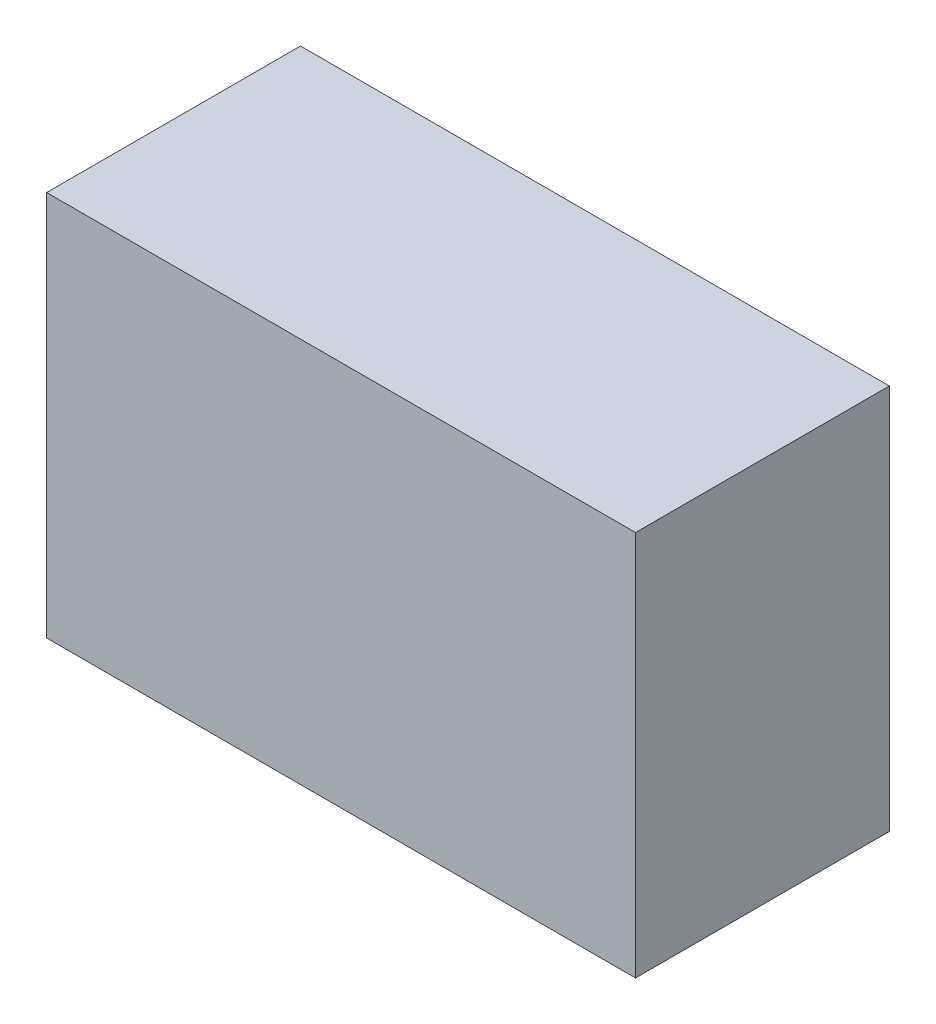
ISO-10303-21;
HEADER;
FILE_DESCRIPTION(('STEP AP214'),'2;1');
FILE_NAME('part.step','',(''),(''),'','','');
FILE_SCHEMA(('AUTOMOTIVE_DESIGN { 1 0 10303 214 1 1 1 1 }'));
ENDSEC;
DATA;
#1=APPLICATION_CONTEXT('core data for automotive mechanical design processes');
#2=APPLICATION_PROTOCOL_DEFINITION('international standard','automotive_design',2000,#1);
#3=PRODUCT_CONTEXT('',#1,'mechanical');
#4=PRODUCT('Part','Part','',(#3));
#5=PRODUCT_RELATED_PRODUCT_CATEGORY('part','',(#4));
#6=PRODUCT_DEFINITION_FORMATION('','',#4);
#7=PRODUCT_DEFINITION_CONTEXT('part definition',#1,'design');
#8=PRODUCT_DEFINITION('design','',#6,#7);
#9=PRODUCT_DEFINITION_SHAPE('','',#8);
#10=(LENGTH_UNIT() NAMED_UNIT(*) SI_UNIT(.MILLI.,.METRE.));
#11=(NAMED_UNIT(*) PLANE_ANGLE_UNIT() SI_UNIT($,.RADIAN.));
#12=(NAMED_UNIT(*) SI_UNIT($,.STERADIAN.) SOLID_ANGLE_UNIT());
#13=UNCERTAINTY_MEASURE_WITH_UNIT(LENGTH_MEASURE(1.E-05),#10,'distance_accuracy_value','');
#14=(GEOMETRIC_REPRESENTATION_CONTEXT(3) GLOBAL_UNCERTAINTY_ASSIGNED_CONTEXT((#13)) GLOBAL_UNIT_ASSIGNED_CONTEXT((#10,
#11,#12)) REPRESENTATION_CONTEXT('',''));
#15=CARTESIAN_POINT('',(0.,0.,0.));
#16=DIRECTION('',(0.,0.,1.));
#17=DIRECTION('',(1.,0.,0.));
#18=AXIS2_PLACEMENT_3D('',#15,#16,#17);
#19=CARTESIAN_POINT('',(-1.45,0.95,1.25));
#20=DIRECTION('',(1.,0.,0.));
#21=DIRECTION('',(0.,0.,-1.));
#22=AXIS2_PLACEMENT_3D('',#19,#20,#21);
#23=PLANE('',#22);
#24=DIRECTION('',(0.,-1.,0.));
#25=VECTOR('',#24,1.);
#26=CARTESIAN_POINT('',(-1.45,0.95,0.));
#27=LINE('',#26,#25);
#28=CARTESIAN_POINT('',(-1.45,0.95,0.));
#29=VERTEX_POINT('',#28);
#30=CARTESIAN_POINT('',(-1.45,-0.95,0.));
#31=VERTEX_POINT('',#30);
#32=EDGE_CURVE('E100',#29,#31,#27,.T.);
#33=ORIENTED_EDGE('',*,*,#32,.T.);
#34=DIRECTION('',(0.,0.,-1.));
#35=VECTOR('',#34,1.);
#36=CARTESIAN_POINT('',(-1.45,-0.95,1.25));
#37=LINE('',#36,#35);
#38=CARTESIAN_POINT('',(-1.45,-0.95,1.25));
#39=VERTEX_POINT('',#38);
#40=EDGE_CURVE('E11',#39,#31,#37,.T.);
#41=ORIENTED_EDGE('',*,*,#40,.F.);
#42=DIRECTION('',(0.,-1.,0.));
#43=VECTOR('',#42,1.);
#44=CARTESIAN_POINT('',(-1.45,0.95,1.25));
#45=LINE('',#44,#43);
#46=CARTESIAN_POINT('',(-1.45,0.95,1.25));
#47=VERTEX_POINT('',#46);
#48=EDGE_CURVE('E88',#47,#39,#45,.T.);
#49=ORIENTED_EDGE('',*,*,#48,.F.);
#50=DIRECTION('',(0.,0.,-1.));
#51=VECTOR('',#50,1.);
#52=CARTESIAN_POINT('',(-1.45,0.95,1.25));
#53=LINE('',#52,#51);
#54=EDGE_CURVE('E96',#47,#29,#53,.T.);
#55=ORIENTED_EDGE('',*,*,#54,.T.);
#56=EDGE_LOOP('',(#33,#41,#49,#55));
#57=FACE_BOUND('',#56,.T.);
#58=ADVANCED_FACE('F37',(#57),#23,.F.);
#59=CARTESIAN_POINT('',(1.45,-0.95,1.25));
#60=DIRECTION('',(0.,1.,0.));
#61=DIRECTION('',(-1.,0.,0.));
#62=AXIS2_PLACEMENT_3D('',#59,#60,#61);
#63=PLANE('',#62);
#64=DIRECTION('',(1.,0.,0.));
#65=VECTOR('',#64,1.);
#66=CARTESIAN_POINT('',(1.45,-0.95,0.));
#67=LINE('',#66,#65);
#68=CARTESIAN_POINT('',(1.45,-0.95,0.));
#69=VERTEX_POINT('',#68);
#70=EDGE_CURVE('E92',#31,#69,#67,.T.);
#71=ORIENTED_EDGE('',*,*,#70,.T.);
#72=DIRECTION('',(0.,0.,-1.));
#73=VECTOR('',#72,1.);
#74=CARTESIAN_POINT('',(1.45,-0.95,1.25));
#75=LINE('',#74,#73);
#76=CARTESIAN_POINT('',(1.45,-0.95,1.25));
#77=VERTEX_POINT('',#76);
#78=EDGE_CURVE('E45',#77,#69,#75,.T.);
#79=ORIENTED_EDGE('',*,*,#78,.F.);
#80=DIRECTION('',(1.,0.,0.));
#81=VECTOR('',#80,1.);
#82=CARTESIAN_POINT('',(1.45,-0.95,1.25));
#83=LINE('',#82,#81);
#84=EDGE_CURVE('E83',#39,#77,#83,.T.);
#85=ORIENTED_EDGE('',*,*,#84,.F.);
#86=ORIENTED_EDGE('',*,*,#40,.T.);
#87=EDGE_LOOP('',(#71,#79,#85,#86));
#88=FACE_BOUND('',#87,.T.);
#89=ADVANCED_FACE('F91',(#88),#63,.F.);
#90=CARTESIAN_POINT('',(1.45,0.95,1.25));
#91=DIRECTION('',(-1.,0.,0.));
#92=DIRECTION('',(0.,-1.,0.));
#93=AXIS2_PLACEMENT_3D('',#90,#91,#92);
#94=PLANE('',#93);
#95=DIRECTION('',(0.,1.,0.));
#96=VECTOR('',#95,1.);
#97=CARTESIAN_POINT('',(1.45,0.95,0.));
#98=LINE('',#97,#96);
#99=CARTESIAN_POINT('',(1.45,0.95,0.));
#100=VERTEX_POINT('',#99);
#101=EDGE_CURVE('E70',#69,#100,#98,.T.);
#102=ORIENTED_EDGE('',*,*,#101,.T.);
#103=DIRECTION('',(0.,0.,-1.));
#104=VECTOR('',#103,1.);
#105=CARTESIAN_POINT('',(1.45,0.95,1.25));
#106=LINE('',#105,#104);
#107=CARTESIAN_POINT('',(1.45,0.95,1.25));
#108=VERTEX_POINT('',#107);
#109=EDGE_CURVE('E93',#108,#100,#106,.T.);
#110=ORIENTED_EDGE('',*,*,#109,.F.);
#111=DIRECTION('',(0.,1.,0.));
#112=VECTOR('',#111,1.);
#113=CARTESIAN_POINT('',(1.45,0.95,1.25));
#114=LINE('',#113,#112);
#115=EDGE_CURVE('E86',#77,#108,#114,.T.);
#116=ORIENTED_EDGE('',*,*,#115,.F.);
#117=ORIENTED_EDGE('',*,*,#78,.T.);
#118=EDGE_LOOP('',(#102,#110,#116,#117));
#119=FACE_BOUND('',#118,.T.);
#120=ADVANCED_FACE('F94',(#119),#94,.F.);
#121=CARTESIAN_POINT('',(1.45,0.95,1.25));
#122=DIRECTION('',(0.,-1.,0.));
#123=DIRECTION('',(1.,0.,0.));
#124=AXIS2_PLACEMENT_3D('',#121,#122,#123);
#125=PLANE('',#124);
#126=DIRECTION('',(-1.,0.,0.));
#127=VECTOR('',#126,1.);
#128=CARTESIAN_POINT('',(1.45,0.95,0.));
#129=LINE('',#128,#127);
#130=EDGE_CURVE('E76',#100,#29,#129,.T.);
#131=ORIENTED_EDGE('',*,*,#130,.T.);
#132=ORIENTED_EDGE('',*,*,#54,.F.);
#133=DIRECTION('',(-1.,0.,0.));
#134=VECTOR('',#133,1.);
#135=CARTESIAN_POINT('',(1.45,0.95,1.25));
#136=LINE('',#135,#134);
#137=EDGE_CURVE('E53',#108,#47,#136,.T.);
#138=ORIENTED_EDGE('',*,*,#137,.F.);
#139=ORIENTED_EDGE('',*,*,#109,.T.);
#140=EDGE_LOOP('',(#131,#132,#138,#139));
#141=FACE_BOUND('',#140,.T.);
#142=ADVANCED_FACE('F107',(#141),#125,.F.);
#143=CARTESIAN_POINT('',(0.,0.,1.25));
#144=DIRECTION('',(0.,0.,-1.));
#145=DIRECTION('',(-1.,0.,0.));
#146=AXIS2_PLACEMENT_3D('',#143,#144,#145);
#147=PLANE('',#146);
#148=ORIENTED_EDGE('',*,*,#48,.T.);
#149=ORIENTED_EDGE('',*,*,#84,.T.);
#150=ORIENTED_EDGE('',*,*,#115,.T.);
#151=ORIENTED_EDGE('',*,*,#137,.T.);
#152=EDGE_LOOP('',(#148,#149,#150,#151));
#153=FACE_BOUND('',#152,.T.);
#154=ADVANCED_FACE('F84',(#153),#147,.F.);
#155=CARTESIAN_POINT('',(0.,0.,0.));
#156=DIRECTION('',(0.,0.,-1.));
#157=DIRECTION('',(-1.,0.,0.));
#158=AXIS2_PLACEMENT_3D('',#155,#156,#157);
#159=PLANE('',#158);
#160=ORIENTED_EDGE('',*,*,#32,.F.);
#161=ORIENTED_EDGE('',*,*,#130,.F.);
#162=ORIENTED_EDGE('',*,*,#101,.F.);
#163=ORIENTED_EDGE('',*,*,#70,.F.);
#164=EDGE_LOOP('',(#160,#161,#162,#163));
#165=FACE_BOUND('',#164,.T.);
#166=ADVANCED_FACE('F110',(#165),#159,.T.);
#167=CLOSED_SHELL('',(#58,#89,#120,#142,#154,#166));
#168=MANIFOLD_SOLID_BREP('B2',#167);
#169=ADVANCED_BREP_SHAPE_REPRESENTATION('',(#18,#168),#14);
#170=SHAPE_DEFINITION_REPRESENTATION(#9,#169);
ENDSEC;
END-ISO-10303-21;
